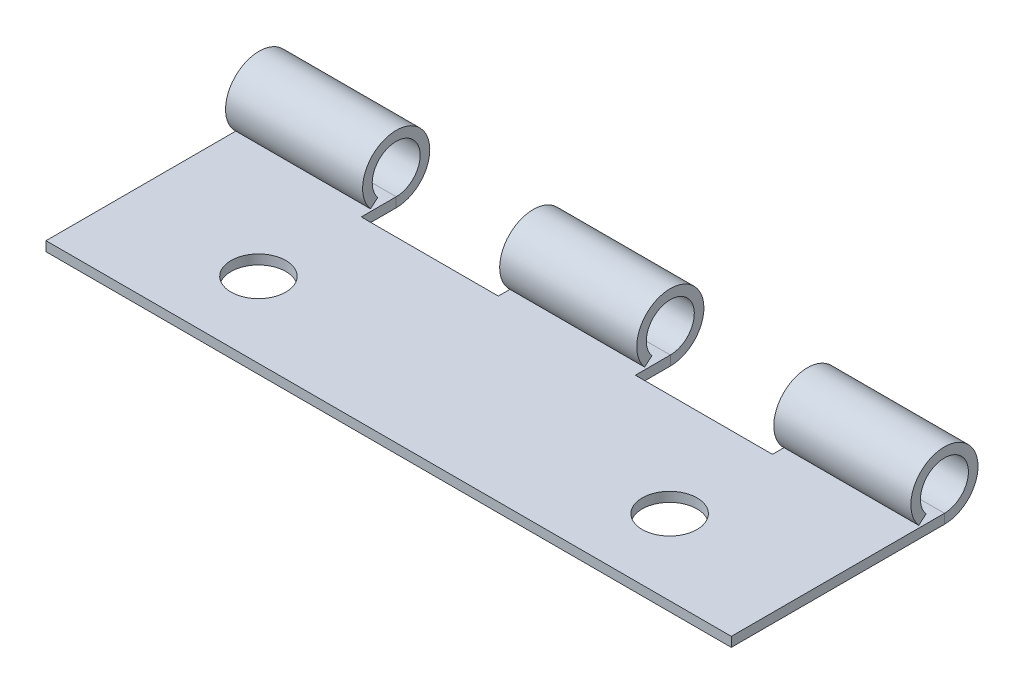
ISO-10303-21;
HEADER;
FILE_DESCRIPTION(('STEP AP214'),'2;1');
FILE_NAME('part.step','',(''),(''),'','','');
FILE_SCHEMA(('AUTOMOTIVE_DESIGN { 1 0 10303 214 1 1 1 1 }'));
ENDSEC;
DATA;
#1=APPLICATION_CONTEXT('core data for automotive mechanical design processes');
#2=APPLICATION_PROTOCOL_DEFINITION('international standard','automotive_design',2000,#1);
#3=PRODUCT_CONTEXT('',#1,'mechanical');
#4=PRODUCT('Part','Part','',(#3));
#5=PRODUCT_RELATED_PRODUCT_CATEGORY('part','',(#4));
#6=PRODUCT_DEFINITION_FORMATION('','',#4);
#7=PRODUCT_DEFINITION_CONTEXT('part definition',#1,'design');
#8=PRODUCT_DEFINITION('design','',#6,#7);
#9=PRODUCT_DEFINITION_SHAPE('','',#8);
#10=(LENGTH_UNIT() NAMED_UNIT(*) SI_UNIT(.MILLI.,.METRE.));
#11=(NAMED_UNIT(*) PLANE_ANGLE_UNIT() SI_UNIT($,.RADIAN.));
#12=(NAMED_UNIT(*) SI_UNIT($,.STERADIAN.) SOLID_ANGLE_UNIT());
#13=UNCERTAINTY_MEASURE_WITH_UNIT(LENGTH_MEASURE(1.E-05),#10,'distance_accuracy_value','');
#14=(GEOMETRIC_REPRESENTATION_CONTEXT(3) GLOBAL_UNCERTAINTY_ASSIGNED_CONTEXT((#13)) GLOBAL_UNIT_ASSIGNED_CONTEXT((#10,
#11,#12)) REPRESENTATION_CONTEXT('',''));
#15=CARTESIAN_POINT('',(0.,0.,0.));
#16=DIRECTION('',(0.,0.,1.));
#17=DIRECTION('',(1.,0.,0.));
#18=AXIS2_PLACEMENT_3D('',#15,#16,#17);
#19=CARTESIAN_POINT('',(15.,-0.7,-13.));
#20=DIRECTION('',(-1.,0.,0.));
#21=DIRECTION('',(0.,0.,1.));
#22=AXIS2_PLACEMENT_3D('',#19,#20,#21);
#23=PLANE('',#22);
#24=DIRECTION('',(0.,0.,1.));
#25=VECTOR('',#24,1.);
#26=CARTESIAN_POINT('',(15.,0.,-13.));
#27=LINE('',#26,#25);
#28=CARTESIAN_POINT('',(15.,0.,-15.55));
#29=VERTEX_POINT('',#28);
#30=CARTESIAN_POINT('',(15.,0.,-13.));
#31=VERTEX_POINT('',#30);
#32=EDGE_CURVE('E227',#29,#31,#27,.T.);
#33=ORIENTED_EDGE('',*,*,#32,.F.);
#34=DIRECTION('',(0.,-1.,0.));
#35=VECTOR('',#34,1.);
#36=CARTESIAN_POINT('',(15.,0.,-15.55));
#37=LINE('',#36,#35);
#38=CARTESIAN_POINT('',(15.,-0.699999999999999,-15.55));
#39=VERTEX_POINT('',#38);
#40=EDGE_CURVE('E177',#29,#39,#37,.T.);
#41=ORIENTED_EDGE('',*,*,#40,.T.);
#42=DIRECTION('',(0.,0.,1.));
#43=VECTOR('',#42,1.);
#44=CARTESIAN_POINT('',(15.,-0.7,-13.));
#45=LINE('',#44,#43);
#46=CARTESIAN_POINT('',(15.,-0.7,-13.));
#47=VERTEX_POINT('',#46);
#48=EDGE_CURVE('E198',#39,#47,#45,.T.);
#49=ORIENTED_EDGE('',*,*,#48,.T.);
#50=DIRECTION('',(0.,1.,0.));
#51=VECTOR('',#50,1.);
#52=CARTESIAN_POINT('',(15.,-0.7,-13.));
#53=LINE('',#52,#51);
#54=EDGE_CURVE('E252',#47,#31,#53,.T.);
#55=ORIENTED_EDGE('',*,*,#54,.T.);
#56=EDGE_LOOP('',(#33,#41,#49,#55));
#57=FACE_BOUND('',#56,.T.);
#58=ADVANCED_FACE('F36',(#57),#23,.T.);
#59=CARTESIAN_POINT('',(-5.,-0.7,-13.));
#60=DIRECTION('',(-1.,0.,0.));
#61=DIRECTION('',(0.,0.,1.));
#62=AXIS2_PLACEMENT_3D('',#59,#60,#61);
#63=PLANE('',#62);
#64=DIRECTION('',(0.,0.,1.));
#65=VECTOR('',#64,1.);
#66=CARTESIAN_POINT('',(-5.,0.,-13.));
#67=LINE('',#66,#65);
#68=CARTESIAN_POINT('',(-5.,0.,-15.55));
#69=VERTEX_POINT('',#68);
#70=CARTESIAN_POINT('',(-5.,0.,-13.));
#71=VERTEX_POINT('',#70);
#72=EDGE_CURVE('E236',#69,#71,#67,.T.);
#73=ORIENTED_EDGE('',*,*,#72,.F.);
#74=DIRECTION('',(0.,-1.,0.));
#75=VECTOR('',#74,1.);
#76=CARTESIAN_POINT('',(-5.,0.,-15.55));
#77=LINE('',#76,#75);
#78=CARTESIAN_POINT('',(-5.,-0.699999999999999,-15.55));
#79=VERTEX_POINT('',#78);
#80=EDGE_CURVE('E303',#69,#79,#77,.T.);
#81=ORIENTED_EDGE('',*,*,#80,.T.);
#82=DIRECTION('',(0.,0.,1.));
#83=VECTOR('',#82,1.);
#84=CARTESIAN_POINT('',(-5.,-0.7,-13.));
#85=LINE('',#84,#83);
#86=CARTESIAN_POINT('',(-5.,-0.7,-13.));
#87=VERTEX_POINT('',#86);
#88=EDGE_CURVE('E215',#79,#87,#85,.T.);
#89=ORIENTED_EDGE('',*,*,#88,.T.);
#90=DIRECTION('',(0.,1.,0.));
#91=VECTOR('',#90,1.);
#92=CARTESIAN_POINT('',(-5.,-0.7,-13.));
#93=LINE('',#92,#91);
#94=EDGE_CURVE('E248',#87,#71,#93,.T.);
#95=ORIENTED_EDGE('',*,*,#94,.T.);
#96=EDGE_LOOP('',(#73,#81,#89,#95));
#97=FACE_BOUND('',#96,.T.);
#98=ADVANCED_FACE('F302',(#97),#63,.T.);
#99=CARTESIAN_POINT('',(-25.,-0.7,0.));
#100=DIRECTION('',(-1.,0.,0.));
#101=DIRECTION('',(0.,0.,1.));
#102=AXIS2_PLACEMENT_3D('',#99,#100,#101);
#103=PLANE('',#102);
#104=DIRECTION('',(0.,0.,1.));
#105=VECTOR('',#104,1.);
#106=CARTESIAN_POINT('',(-25.,0.,0.));
#107=LINE('',#106,#105);
#108=CARTESIAN_POINT('',(-25.,0.,-15.55));
#109=VERTEX_POINT('',#108);
#110=CARTESIAN_POINT('',(-25.,0.,0.));
#111=VERTEX_POINT('',#110);
#112=EDGE_CURVE('E244',#109,#111,#107,.T.);
#113=ORIENTED_EDGE('',*,*,#112,.F.);
#114=DIRECTION('',(0.,-1.,0.));
#115=VECTOR('',#114,1.);
#116=CARTESIAN_POINT('',(-25.,0.,-15.55));
#117=LINE('',#116,#115);
#118=CARTESIAN_POINT('',(-25.,-0.699999999999999,-15.55));
#119=VERTEX_POINT('',#118);
#120=EDGE_CURVE('E274',#109,#119,#117,.T.);
#121=ORIENTED_EDGE('',*,*,#120,.T.);
#122=DIRECTION('',(0.,0.,1.));
#123=VECTOR('',#122,1.);
#124=CARTESIAN_POINT('',(-25.,-0.7,0.));
#125=LINE('',#124,#123);
#126=CARTESIAN_POINT('',(-25.,-0.7,0.));
#127=VERTEX_POINT('',#126);
#128=EDGE_CURVE('E223',#119,#127,#125,.T.);
#129=ORIENTED_EDGE('',*,*,#128,.T.);
#130=DIRECTION('',(0.,1.,0.));
#131=VECTOR('',#130,1.);
#132=CARTESIAN_POINT('',(-25.,-0.7,0.));
#133=LINE('',#132,#131);
#134=EDGE_CURVE('E11',#127,#111,#133,.T.);
#135=ORIENTED_EDGE('',*,*,#134,.T.);
#136=EDGE_LOOP('',(#113,#121,#129,#135));
#137=FACE_BOUND('',#136,.T.);
#138=ADVANCED_FACE('F271',(#137),#103,.T.);
#139=CARTESIAN_POINT('',(0.,-0.7,0.));
#140=DIRECTION('',(0.,0.,1.));
#141=DIRECTION('',(1.,0.,0.));
#142=AXIS2_PLACEMENT_3D('',#139,#140,#141);
#143=PLANE('',#142);
#144=DIRECTION('',(1.,0.,0.));
#145=VECTOR('',#144,1.);
#146=CARTESIAN_POINT('',(0.,0.,0.));
#147=LINE('',#146,#145);
#148=CARTESIAN_POINT('',(25.,0.,0.));
#149=VERTEX_POINT('',#148);
#150=EDGE_CURVE('E206',#111,#149,#147,.T.);
#151=ORIENTED_EDGE('',*,*,#150,.F.);
#152=ORIENTED_EDGE('',*,*,#134,.F.);
#153=DIRECTION('',(1.,0.,0.));
#154=VECTOR('',#153,1.);
#155=CARTESIAN_POINT('',(25.,-0.7,0.));
#156=LINE('',#155,#154);
#157=CARTESIAN_POINT('',(25.,-0.7,0.));
#158=VERTEX_POINT('',#157);
#159=EDGE_CURVE('E202',#127,#158,#156,.T.);
#160=ORIENTED_EDGE('',*,*,#159,.T.);
#161=DIRECTION('',(0.,1.,0.));
#162=VECTOR('',#161,1.);
#163=CARTESIAN_POINT('',(25.,-0.7,0.));
#164=LINE('',#163,#162);
#165=EDGE_CURVE('E40',#158,#149,#164,.T.);
#166=ORIENTED_EDGE('',*,*,#165,.T.);
#167=EDGE_LOOP('',(#151,#152,#160,#166));
#168=FACE_BOUND('',#167,.T.);
#169=ADVANCED_FACE('F260',(#168),#143,.T.);
#170=CARTESIAN_POINT('',(-15.,-0.7,-18.));
#171=DIRECTION('',(1.,0.,0.));
#172=DIRECTION('',(0.,0.,-1.));
#173=AXIS2_PLACEMENT_3D('',#170,#171,#172);
#174=PLANE('',#173);
#175=DIRECTION('',(0.,-1.,0.));
#176=VECTOR('',#175,1.);
#177=CARTESIAN_POINT('',(-15.,0.,-15.55));
#178=LINE('',#177,#176);
#179=CARTESIAN_POINT('',(-15.,0.,-15.55));
#180=VERTEX_POINT('',#179);
#181=CARTESIAN_POINT('',(-15.,-0.699999999999999,-15.55));
#182=VERTEX_POINT('',#181);
#183=EDGE_CURVE('E290',#180,#182,#178,.T.);
#184=ORIENTED_EDGE('',*,*,#183,.F.);
#185=DIRECTION('',(0.,0.,-1.));
#186=VECTOR('',#185,1.);
#187=CARTESIAN_POINT('',(-15.,0.,-18.));
#188=LINE('',#187,#186);
#189=CARTESIAN_POINT('',(-15.,0.,-13.));
#190=VERTEX_POINT('',#189);
#191=EDGE_CURVE('E241',#190,#180,#188,.T.);
#192=ORIENTED_EDGE('',*,*,#191,.F.);
#193=DIRECTION('',(0.,1.,0.));
#194=VECTOR('',#193,1.);
#195=CARTESIAN_POINT('',(-15.,-0.7,-13.));
#196=LINE('',#195,#194);
#197=CARTESIAN_POINT('',(-15.,-0.7,-13.));
#198=VERTEX_POINT('',#197);
#199=EDGE_CURVE('E45',#198,#190,#196,.T.);
#200=ORIENTED_EDGE('',*,*,#199,.F.);
#201=DIRECTION('',(0.,0.,-1.));
#202=VECTOR('',#201,1.);
#203=CARTESIAN_POINT('',(-15.,-0.7,-18.));
#204=LINE('',#203,#202);
#205=EDGE_CURVE('E220',#198,#182,#204,.T.);
#206=ORIENTED_EDGE('',*,*,#205,.T.);
#207=EDGE_LOOP('',(#184,#192,#200,#206));
#208=FACE_BOUND('',#207,.T.);
#209=ADVANCED_FACE('F288',(#208),#174,.T.);
#210=CARTESIAN_POINT('',(-15.,-0.7,-13.));
#211=DIRECTION('',(0.,0.,-1.));
#212=DIRECTION('',(-1.,0.,0.));
#213=AXIS2_PLACEMENT_3D('',#210,#211,#212);
#214=PLANE('',#213);
#215=DIRECTION('',(-1.,0.,0.));
#216=VECTOR('',#215,1.);
#217=CARTESIAN_POINT('',(-15.,0.,-13.));
#218=LINE('',#217,#216);
#219=EDGE_CURVE('E238',#71,#190,#218,.T.);
#220=ORIENTED_EDGE('',*,*,#219,.F.);
#221=ORIENTED_EDGE('',*,*,#94,.F.);
#222=DIRECTION('',(-1.,0.,0.));
#223=VECTOR('',#222,1.);
#224=CARTESIAN_POINT('',(-15.,-0.7,-13.));
#225=LINE('',#224,#223);
#226=EDGE_CURVE('E217',#87,#198,#225,.T.);
#227=ORIENTED_EDGE('',*,*,#226,.T.);
#228=ORIENTED_EDGE('',*,*,#199,.T.);
#229=EDGE_LOOP('',(#220,#221,#227,#228));
#230=FACE_BOUND('',#229,.T.);
#231=ADVANCED_FACE('F293',(#230),#214,.T.);
#232=CARTESIAN_POINT('',(5.,-0.7,-18.));
#233=DIRECTION('',(1.,0.,0.));
#234=DIRECTION('',(0.,0.,-1.));
#235=AXIS2_PLACEMENT_3D('',#232,#233,#234);
#236=PLANE('',#235);
#237=DIRECTION('',(0.,-1.,0.));
#238=VECTOR('',#237,1.);
#239=CARTESIAN_POINT('',(5.,0.,-15.55));
#240=LINE('',#239,#238);
#241=CARTESIAN_POINT('',(5.,0.,-15.55));
#242=VERTEX_POINT('',#241);
#243=CARTESIAN_POINT('',(5.,-0.699999999999999,-15.55));
#244=VERTEX_POINT('',#243);
#245=EDGE_CURVE('E307',#242,#244,#240,.T.);
#246=ORIENTED_EDGE('',*,*,#245,.F.);
#247=DIRECTION('',(0.,0.,-1.));
#248=VECTOR('',#247,1.);
#249=CARTESIAN_POINT('',(5.,0.,-18.));
#250=LINE('',#249,#248);
#251=CARTESIAN_POINT('',(5.,0.,-13.));
#252=VERTEX_POINT('',#251);
#253=EDGE_CURVE('E233',#252,#242,#250,.T.);
#254=ORIENTED_EDGE('',*,*,#253,.F.);
#255=DIRECTION('',(0.,1.,0.));
#256=VECTOR('',#255,1.);
#257=CARTESIAN_POINT('',(5.,-0.7,-13.));
#258=LINE('',#257,#256);
#259=CARTESIAN_POINT('',(5.,-0.7,-13.));
#260=VERTEX_POINT('',#259);
#261=EDGE_CURVE('E251',#260,#252,#258,.T.);
#262=ORIENTED_EDGE('',*,*,#261,.F.);
#263=DIRECTION('',(0.,0.,-1.));
#264=VECTOR('',#263,1.);
#265=CARTESIAN_POINT('',(5.,-0.7,-18.));
#266=LINE('',#265,#264);
#267=EDGE_CURVE('E212',#260,#244,#266,.T.);
#268=ORIENTED_EDGE('',*,*,#267,.T.);
#269=EDGE_LOOP('',(#246,#254,#262,#268));
#270=FACE_BOUND('',#269,.T.);
#271=ADVANCED_FACE('F374',(#270),#236,.T.);
#272=CARTESIAN_POINT('',(5.,-0.7,-13.));
#273=DIRECTION('',(0.,0.,-1.));
#274=DIRECTION('',(-1.,0.,0.));
#275=AXIS2_PLACEMENT_3D('',#272,#273,#274);
#276=PLANE('',#275);
#277=DIRECTION('',(-1.,0.,0.));
#278=VECTOR('',#277,1.);
#279=CARTESIAN_POINT('',(5.,0.,-13.));
#280=LINE('',#279,#278);
#281=EDGE_CURVE('E230',#31,#252,#280,.T.);
#282=ORIENTED_EDGE('',*,*,#281,.F.);
#283=ORIENTED_EDGE('',*,*,#54,.F.);
#284=DIRECTION('',(-1.,0.,0.));
#285=VECTOR('',#284,1.);
#286=CARTESIAN_POINT('',(5.,-0.7,-13.));
#287=LINE('',#286,#285);
#288=EDGE_CURVE('E204',#47,#260,#287,.T.);
#289=ORIENTED_EDGE('',*,*,#288,.T.);
#290=ORIENTED_EDGE('',*,*,#261,.T.);
#291=EDGE_LOOP('',(#282,#283,#289,#290));
#292=FACE_BOUND('',#291,.T.);
#293=ADVANCED_FACE('F371',(#292),#276,.T.);
#294=CARTESIAN_POINT('',(25.,-0.7,-18.));
#295=DIRECTION('',(1.,0.,0.));
#296=DIRECTION('',(0.,0.,-1.));
#297=AXIS2_PLACEMENT_3D('',#294,#295,#296);
#298=PLANE('',#297);
#299=DIRECTION('',(0.,-1.,0.));
#300=VECTOR('',#299,1.);
#301=CARTESIAN_POINT('',(25.,0.,-15.55));
#302=LINE('',#301,#300);
#303=CARTESIAN_POINT('',(25.,0.,-15.55));
#304=VERTEX_POINT('',#303);
#305=CARTESIAN_POINT('',(25.,-0.699999999999998,-15.55));
#306=VERTEX_POINT('',#305);
#307=EDGE_CURVE('E166',#304,#306,#302,.T.);
#308=ORIENTED_EDGE('',*,*,#307,.F.);
#309=DIRECTION('',(0.,0.,-1.));
#310=VECTOR('',#309,1.);
#311=CARTESIAN_POINT('',(25.,0.,-18.));
#312=LINE('',#311,#310);
#313=EDGE_CURVE('E225',#149,#304,#312,.T.);
#314=ORIENTED_EDGE('',*,*,#313,.F.);
#315=ORIENTED_EDGE('',*,*,#165,.F.);
#316=DIRECTION('',(0.,0.,-1.));
#317=VECTOR('',#316,1.);
#318=CARTESIAN_POINT('',(25.,-0.7,-18.));
#319=LINE('',#318,#317);
#320=EDGE_CURVE('E195',#158,#306,#319,.T.);
#321=ORIENTED_EDGE('',*,*,#320,.T.);
#322=EDGE_LOOP('',(#308,#314,#315,#321));
#323=FACE_BOUND('',#322,.T.);
#324=ADVANCED_FACE('F38',(#323),#298,.T.);
#325=CARTESIAN_POINT('',(0.,-0.7,0.));
#326=DIRECTION('',(0.,-1.,0.));
#327=DIRECTION('',(0.,0.,-1.));
#328=AXIS2_PLACEMENT_3D('',#325,#326,#327);
#329=PLANE('',#328);
#330=DIRECTION('',(-1.,0.,0.));
#331=VECTOR('',#330,1.);
#332=CARTESIAN_POINT('',(15.,-0.699999999999999,-15.55));
#333=LINE('',#332,#331);
#334=EDGE_CURVE('E184',#39,#306,#333,.F.);
#335=ORIENTED_EDGE('',*,*,#334,.T.);
#336=ORIENTED_EDGE('',*,*,#320,.F.);
#337=ORIENTED_EDGE('',*,*,#159,.F.);
#338=ORIENTED_EDGE('',*,*,#128,.F.);
#339=DIRECTION('',(-1.,0.,0.));
#340=VECTOR('',#339,1.);
#341=CARTESIAN_POINT('',(-25.,-0.699999999999999,-15.55));
#342=LINE('',#341,#340);
#343=EDGE_CURVE('E277',#119,#182,#342,.F.);
#344=ORIENTED_EDGE('',*,*,#343,.T.);
#345=ORIENTED_EDGE('',*,*,#205,.F.);
#346=ORIENTED_EDGE('',*,*,#226,.F.);
#347=ORIENTED_EDGE('',*,*,#88,.F.);
#348=DIRECTION('',(-1.,0.,0.));
#349=VECTOR('',#348,1.);
#350=CARTESIAN_POINT('',(-5.,-0.699999999999999,-15.55));
#351=LINE('',#350,#349);
#352=EDGE_CURVE('E298',#79,#244,#351,.F.);
#353=ORIENTED_EDGE('',*,*,#352,.T.);
#354=ORIENTED_EDGE('',*,*,#267,.F.);
#355=ORIENTED_EDGE('',*,*,#288,.F.);
#356=ORIENTED_EDGE('',*,*,#48,.F.);
#357=EDGE_LOOP('',(#335,#336,#337,#338,#344,#345,#346,#347,#353,#354,#355,#356));
#358=FACE_BOUND('',#357,.T.);
#359=CARTESIAN_POINT('',(15.,-0.7,-5.5));
#360=DIRECTION('',(0.,1.,0.));
#361=DIRECTION('',(0.,0.,-1.));
#362=AXIS2_PLACEMENT_3D('',#359,#360,#361);
#363=CIRCLE('',#362,2.);
#364=CARTESIAN_POINT('',(15.,-0.7,-7.5));
#365=VERTEX_POINT('',#364);
#366=EDGE_CURVE('E340',#365,#365,#363,.T.);
#367=ORIENTED_EDGE('',*,*,#366,.T.);
#368=EDGE_LOOP('',(#367));
#369=FACE_BOUND('',#368,.T.);
#370=CARTESIAN_POINT('',(-15.,-0.7,-5.49999999999999));
#371=DIRECTION('',(0.,1.,0.));
#372=DIRECTION('',(0.,0.,1.));
#373=AXIS2_PLACEMENT_3D('',#370,#371,#372);
#374=CIRCLE('',#373,2.);
#375=CARTESIAN_POINT('',(-15.,-0.7,-3.49999999999999));
#376=VERTEX_POINT('',#375);
#377=EDGE_CURVE('E228',#376,#376,#374,.T.);
#378=ORIENTED_EDGE('',*,*,#377,.T.);
#379=EDGE_LOOP('',(#378));
#380=FACE_BOUND('',#379,.T.);
#381=ADVANCED_FACE('F192',(#358,#369,#380),#329,.T.);
#382=CARTESIAN_POINT('',(0.,0.,0.));
#383=DIRECTION('',(0.,-1.,0.));
#384=DIRECTION('',(0.,0.,-1.));
#385=AXIS2_PLACEMENT_3D('',#382,#383,#384);
#386=PLANE('',#385);
#387=CARTESIAN_POINT('',(15.,0.,-5.5));
#388=DIRECTION('',(0.,1.,0.));
#389=DIRECTION('',(0.,0.,-1.));
#390=AXIS2_PLACEMENT_3D('',#387,#388,#389);
#391=CIRCLE('',#390,2.);
#392=CARTESIAN_POINT('',(15.,0.,-7.5));
#393=VERTEX_POINT('',#392);
#394=EDGE_CURVE('E338',#393,#393,#391,.T.);
#395=ORIENTED_EDGE('',*,*,#394,.F.);
#396=EDGE_LOOP('',(#395));
#397=FACE_BOUND('',#396,.T.);
#398=CARTESIAN_POINT('',(-15.,0.,-5.49999999999999));
#399=DIRECTION('',(0.,1.,0.));
#400=DIRECTION('',(0.,0.,1.));
#401=AXIS2_PLACEMENT_3D('',#398,#399,#400);
#402=CIRCLE('',#401,2.);
#403=CARTESIAN_POINT('',(-15.,0.,-3.49999999999999));
#404=VERTEX_POINT('',#403);
#405=EDGE_CURVE('E343',#404,#404,#402,.T.);
#406=ORIENTED_EDGE('',*,*,#405,.F.);
#407=EDGE_LOOP('',(#406));
#408=FACE_BOUND('',#407,.T.);
#409=ORIENTED_EDGE('',*,*,#313,.T.);
#410=DIRECTION('',(-1.,0.,0.));
#411=VECTOR('',#410,1.);
#412=CARTESIAN_POINT('',(15.,0.,-15.55));
#413=LINE('',#412,#411);
#414=EDGE_CURVE('E265',#29,#304,#413,.F.);
#415=ORIENTED_EDGE('',*,*,#414,.F.);
#416=ORIENTED_EDGE('',*,*,#32,.T.);
#417=ORIENTED_EDGE('',*,*,#281,.T.);
#418=ORIENTED_EDGE('',*,*,#253,.T.);
#419=DIRECTION('',(-1.,0.,0.));
#420=VECTOR('',#419,1.);
#421=CARTESIAN_POINT('',(-5.,0.,-15.55));
#422=LINE('',#421,#420);
#423=EDGE_CURVE('E690',#69,#242,#422,.F.);
#424=ORIENTED_EDGE('',*,*,#423,.F.);
#425=ORIENTED_EDGE('',*,*,#72,.T.);
#426=ORIENTED_EDGE('',*,*,#219,.T.);
#427=ORIENTED_EDGE('',*,*,#191,.T.);
#428=DIRECTION('',(-1.,0.,0.));
#429=VECTOR('',#428,1.);
#430=CARTESIAN_POINT('',(-25.,0.,-15.55));
#431=LINE('',#430,#429);
#432=EDGE_CURVE('E268',#109,#180,#431,.F.);
#433=ORIENTED_EDGE('',*,*,#432,.F.);
#434=ORIENTED_EDGE('',*,*,#112,.T.);
#435=ORIENTED_EDGE('',*,*,#150,.T.);
#436=EDGE_LOOP('',(#409,#415,#416,#417,#418,#424,#425,#426,#427,#433,#434,#435));
#437=FACE_BOUND('',#436,.T.);
#438=ADVANCED_FACE('F264',(#397,#408,#437),#386,.F.);
#439=CARTESIAN_POINT('',(-15.,-0.7,-5.49999999999999));
#440=DIRECTION('',(0.,1.,0.));
#441=DIRECTION('',(0.,0.,1.));
#442=AXIS2_PLACEMENT_3D('',#439,#440,#441);
#443=CYLINDRICAL_SURFACE('',#442,2.);
#444=ORIENTED_EDGE('',*,*,#377,.F.);
#445=EDGE_LOOP('',(#444));
#446=FACE_BOUND('',#445,.T.);
#447=ORIENTED_EDGE('',*,*,#405,.T.);
#448=EDGE_LOOP('',(#447));
#449=FACE_BOUND('',#448,.T.);
#450=ADVANCED_FACE('F350',(#446,#449),#443,.F.);
#451=CARTESIAN_POINT('',(15.,-0.7,-5.5));
#452=DIRECTION('',(0.,1.,0.));
#453=DIRECTION('',(0.,0.,1.));
#454=AXIS2_PLACEMENT_3D('',#451,#452,#453);
#455=CYLINDRICAL_SURFACE('',#454,2.);
#456=ORIENTED_EDGE('',*,*,#366,.F.);
#457=EDGE_LOOP('',(#456));
#458=FACE_BOUND('',#457,.T.);
#459=ORIENTED_EDGE('',*,*,#394,.T.);
#460=EDGE_LOOP('',(#459));
#461=FACE_BOUND('',#460,.T.);
#462=ADVANCED_FACE('F359',(#458,#461),#455,.F.);
#463=CARTESIAN_POINT('',(-20.,0.625121683048546,-14.2094222245418));
#464=DIRECTION('',(0.,0.766044443118973,0.642787609686546));
#465=DIRECTION('',(-1.,0.,0.));
#466=AXIS2_PLACEMENT_3D('',#463,#464,#465);
#467=PLANE('',#466);
#468=DIRECTION('',(0.,-0.642787609686545,0.766044443118973));
#469=VECTOR('',#468,1.);
#470=CARTESIAN_POINT('',(-25.,0.625121683048546,-14.2094222245418));
#471=LINE('',#470,#469);
#472=CARTESIAN_POINT('',(-25.,0.625121683048546,-14.2094222245418));
#473=VERTEX_POINT('',#472);
#474=CARTESIAN_POINT('',(-25.,0.175170356267964,-13.6731911143585));
#475=VERTEX_POINT('',#474);
#476=EDGE_CURVE('E336',#473,#475,#471,.T.);
#477=ORIENTED_EDGE('',*,*,#476,.F.);
#478=DIRECTION('',(-1.,0.,0.));
#479=VECTOR('',#478,1.);
#480=CARTESIAN_POINT('',(-25.,0.625121683048546,-14.2094222245418));
#481=LINE('',#480,#479);
#482=CARTESIAN_POINT('',(-15.,0.625121683048545,-14.2094222245418));
#483=VERTEX_POINT('',#482);
#484=EDGE_CURVE('E330',#483,#473,#481,.T.);
#485=ORIENTED_EDGE('',*,*,#484,.F.);
#486=DIRECTION('',(0.,-0.642787609686545,0.766044443118973));
#487=VECTOR('',#486,1.);
#488=CARTESIAN_POINT('',(-15.,0.625121683048545,-14.2094222245418));
#489=LINE('',#488,#487);
#490=CARTESIAN_POINT('',(-15.,0.175170356267964,-13.6731911143585));
#491=VERTEX_POINT('',#490);
#492=EDGE_CURVE('E334',#483,#491,#489,.T.);
#493=ORIENTED_EDGE('',*,*,#492,.T.);
#494=DIRECTION('',(-1.,0.,0.));
#495=VECTOR('',#494,1.);
#496=CARTESIAN_POINT('',(-25.,0.175170356267964,-13.6731911143585));
#497=LINE('',#496,#495);
#498=EDGE_CURVE('E320',#491,#475,#497,.T.);
#499=ORIENTED_EDGE('',*,*,#498,.T.);
#500=EDGE_LOOP('',(#477,#485,#493,#499));
#501=FACE_BOUND('',#500,.T.);
#502=ADVANCED_FACE('F427',(#501),#467,.F.);
#503=CARTESIAN_POINT('',(-15.,1.75,-15.55));
#504=DIRECTION('',(1.,0.,0.));
#505=DIRECTION('',(0.,1.,0.));
#506=AXIS2_PLACEMENT_3D('',#503,#504,#505);
#507=PLANE('',#506);
#508=ORIENTED_EDGE('',*,*,#492,.F.);
#509=CARTESIAN_POINT('',(-15.,1.75,-15.55));
#510=DIRECTION('',(-1.,0.,0.));
#511=DIRECTION('',(0.,-1.,0.));
#512=AXIS2_PLACEMENT_3D('',#509,#510,#511);
#513=CIRCLE('',#512,1.75);
#514=EDGE_CURVE('E323',#180,#483,#513,.F.);
#515=ORIENTED_EDGE('',*,*,#514,.F.);
#516=ORIENTED_EDGE('',*,*,#183,.T.);
#517=CARTESIAN_POINT('',(-15.,1.75,-15.55));
#518=DIRECTION('',(-1.,0.,0.));
#519=DIRECTION('',(0.,-1.,0.));
#520=AXIS2_PLACEMENT_3D('',#517,#518,#519);
#521=CIRCLE('',#520,2.45);
#522=EDGE_CURVE('E283',#182,#491,#521,.F.);
#523=ORIENTED_EDGE('',*,*,#522,.T.);
#524=EDGE_LOOP('',(#508,#515,#516,#523));
#525=FACE_BOUND('',#524,.T.);
#526=ADVANCED_FACE('F432',(#525),#507,.T.);
#527=CARTESIAN_POINT('',(-25.,1.75,-15.55));
#528=DIRECTION('',(1.,0.,0.));
#529=DIRECTION('',(0.,1.,0.));
#530=AXIS2_PLACEMENT_3D('',#527,#528,#529);
#531=PLANE('',#530);
#532=CARTESIAN_POINT('',(-25.,1.75,-15.55));
#533=DIRECTION('',(-1.,0.,0.));
#534=DIRECTION('',(0.,-1.,0.));
#535=AXIS2_PLACEMENT_3D('',#532,#533,#534);
#536=CIRCLE('',#535,1.75);
#537=EDGE_CURVE('E328',#473,#109,#536,.T.);
#538=ORIENTED_EDGE('',*,*,#537,.F.);
#539=ORIENTED_EDGE('',*,*,#476,.T.);
#540=CARTESIAN_POINT('',(-25.,1.75,-15.55));
#541=DIRECTION('',(-1.,0.,0.));
#542=DIRECTION('',(0.,-1.,0.));
#543=AXIS2_PLACEMENT_3D('',#540,#541,#542);
#544=CIRCLE('',#543,2.45);
#545=EDGE_CURVE('E284',#475,#119,#544,.T.);
#546=ORIENTED_EDGE('',*,*,#545,.T.);
#547=ORIENTED_EDGE('',*,*,#120,.F.);
#548=EDGE_LOOP('',(#538,#539,#546,#547));
#549=FACE_BOUND('',#548,.T.);
#550=ADVANCED_FACE('F445',(#549),#531,.F.);
#551=CARTESIAN_POINT('',(-25.,1.75,-15.55));
#552=DIRECTION('',(-1.,0.,0.));
#553=DIRECTION('',(0.,-0.642787609686546,0.766044443118973));
#554=AXIS2_PLACEMENT_3D('',#551,#552,#553);
#555=CYLINDRICAL_SURFACE('',#554,2.45);
#556=ORIENTED_EDGE('',*,*,#343,.F.);
#557=ORIENTED_EDGE('',*,*,#545,.F.);
#558=ORIENTED_EDGE('',*,*,#498,.F.);
#559=ORIENTED_EDGE('',*,*,#522,.F.);
#560=EDGE_LOOP('',(#556,#557,#558,#559));
#561=FACE_BOUND('',#560,.T.);
#562=ADVANCED_FACE('F456',(#561),#555,.T.);
#563=CARTESIAN_POINT('',(-25.,1.75,-15.55));
#564=DIRECTION('',(-1.,0.,0.));
#565=DIRECTION('',(0.,-0.642787609686546,0.766044443118973));
#566=AXIS2_PLACEMENT_3D('',#563,#564,#565);
#567=CYLINDRICAL_SURFACE('',#566,1.75);
#568=ORIENTED_EDGE('',*,*,#432,.T.);
#569=ORIENTED_EDGE('',*,*,#514,.T.);
#570=ORIENTED_EDGE('',*,*,#484,.T.);
#571=ORIENTED_EDGE('',*,*,#537,.T.);
#572=EDGE_LOOP('',(#568,#569,#570,#571));
#573=FACE_BOUND('',#572,.T.);
#574=ADVANCED_FACE('F467',(#573),#567,.F.);
#575=CARTESIAN_POINT('',(0.,0.625121683048546,-14.2094222245418));
#576=DIRECTION('',(0.,0.766044443118973,0.642787609686546));
#577=DIRECTION('',(-1.,0.,0.));
#578=AXIS2_PLACEMENT_3D('',#575,#576,#577);
#579=PLANE('',#578);
#580=DIRECTION('',(0.,-0.642787609686545,0.766044443118973));
#581=VECTOR('',#580,1.);
#582=CARTESIAN_POINT('',(-5.,0.625121683048546,-14.2094222245418));
#583=LINE('',#582,#581);
#584=CARTESIAN_POINT('',(-5.,0.625121683048546,-14.2094222245418));
#585=VERTEX_POINT('',#584);
#586=CARTESIAN_POINT('',(-5.,0.175170356267964,-13.6731911143585));
#587=VERTEX_POINT('',#586);
#588=EDGE_CURVE('E315',#585,#587,#583,.T.);
#589=ORIENTED_EDGE('',*,*,#588,.F.);
#590=DIRECTION('',(-1.,0.,0.));
#591=VECTOR('',#590,1.);
#592=CARTESIAN_POINT('',(-5.,0.625121683048546,-14.2094222245418));
#593=LINE('',#592,#591);
#594=CARTESIAN_POINT('',(5.,0.625121683048545,-14.2094222245418));
#595=VERTEX_POINT('',#594);
#596=EDGE_CURVE('E678',#595,#585,#593,.T.);
#597=ORIENTED_EDGE('',*,*,#596,.F.);
#598=DIRECTION('',(0.,-0.642787609686545,0.766044443118973));
#599=VECTOR('',#598,1.);
#600=CARTESIAN_POINT('',(5.,0.625121683048545,-14.2094222245418));
#601=LINE('',#600,#599);
#602=CARTESIAN_POINT('',(5.,0.175170356267964,-13.6731911143585));
#603=VERTEX_POINT('',#602);
#604=EDGE_CURVE('E310',#595,#603,#601,.T.);
#605=ORIENTED_EDGE('',*,*,#604,.T.);
#606=DIRECTION('',(-1.,0.,0.));
#607=VECTOR('',#606,1.);
#608=CARTESIAN_POINT('',(-5.,0.175170356267964,-13.6731911143585));
#609=LINE('',#608,#607);
#610=EDGE_CURVE('E683',#603,#587,#609,.T.);
#611=ORIENTED_EDGE('',*,*,#610,.T.);
#612=EDGE_LOOP('',(#589,#597,#605,#611));
#613=FACE_BOUND('',#612,.T.);
#614=ADVANCED_FACE('F477',(#613),#579,.F.);
#615=CARTESIAN_POINT('',(5.,1.75,-15.55));
#616=DIRECTION('',(1.,0.,0.));
#617=DIRECTION('',(0.,1.,0.));
#618=AXIS2_PLACEMENT_3D('',#615,#616,#617);
#619=PLANE('',#618);
#620=ORIENTED_EDGE('',*,*,#604,.F.);
#621=CARTESIAN_POINT('',(5.,1.75,-15.55));
#622=DIRECTION('',(-1.,0.,0.));
#623=DIRECTION('',(0.,-1.,0.));
#624=AXIS2_PLACEMENT_3D('',#621,#622,#623);
#625=CIRCLE('',#624,1.75);
#626=EDGE_CURVE('E686',#242,#595,#625,.F.);
#627=ORIENTED_EDGE('',*,*,#626,.F.);
#628=ORIENTED_EDGE('',*,*,#245,.T.);
#629=CARTESIAN_POINT('',(5.,1.75,-15.55));
#630=DIRECTION('',(-1.,0.,0.));
#631=DIRECTION('',(0.,-1.,0.));
#632=AXIS2_PLACEMENT_3D('',#629,#630,#631);
#633=CIRCLE('',#632,2.45);
#634=EDGE_CURVE('E308',#244,#603,#633,.F.);
#635=ORIENTED_EDGE('',*,*,#634,.T.);
#636=EDGE_LOOP('',(#620,#627,#628,#635));
#637=FACE_BOUND('',#636,.T.);
#638=ADVANCED_FACE('F488',(#637),#619,.T.);
#639=CARTESIAN_POINT('',(-5.,1.75,-15.55));
#640=DIRECTION('',(1.,0.,0.));
#641=DIRECTION('',(0.,1.,0.));
#642=AXIS2_PLACEMENT_3D('',#639,#640,#641);
#643=PLANE('',#642);
#644=CARTESIAN_POINT('',(-5.,1.75,-15.55));
#645=DIRECTION('',(-1.,0.,0.));
#646=DIRECTION('',(0.,-1.,0.));
#647=AXIS2_PLACEMENT_3D('',#644,#645,#646);
#648=CIRCLE('',#647,1.75);
#649=EDGE_CURVE('E61',#585,#69,#648,.T.);
#650=ORIENTED_EDGE('',*,*,#649,.F.);
#651=ORIENTED_EDGE('',*,*,#588,.T.);
#652=CARTESIAN_POINT('',(-5.,1.75,-15.55));
#653=DIRECTION('',(-1.,0.,0.));
#654=DIRECTION('',(0.,-1.,0.));
#655=AXIS2_PLACEMENT_3D('',#652,#653,#654);
#656=CIRCLE('',#655,2.45);
#657=EDGE_CURVE('E681',#587,#79,#656,.T.);
#658=ORIENTED_EDGE('',*,*,#657,.T.);
#659=ORIENTED_EDGE('',*,*,#80,.F.);
#660=EDGE_LOOP('',(#650,#651,#658,#659));
#661=FACE_BOUND('',#660,.T.);
#662=ADVANCED_FACE('F499',(#661),#643,.F.);
#663=CARTESIAN_POINT('',(-5.,1.75,-15.55));
#664=DIRECTION('',(-1.,0.,0.));
#665=DIRECTION('',(0.,-0.642787609686546,0.766044443118973));
#666=AXIS2_PLACEMENT_3D('',#663,#664,#665);
#667=CYLINDRICAL_SURFACE('',#666,2.45);
#668=ORIENTED_EDGE('',*,*,#352,.F.);
#669=ORIENTED_EDGE('',*,*,#657,.F.);
#670=ORIENTED_EDGE('',*,*,#610,.F.);
#671=ORIENTED_EDGE('',*,*,#634,.F.);
#672=EDGE_LOOP('',(#668,#669,#670,#671));
#673=FACE_BOUND('',#672,.T.);
#674=ADVANCED_FACE('F510',(#673),#667,.T.);
#675=CARTESIAN_POINT('',(-5.,1.75,-15.55));
#676=DIRECTION('',(-1.,0.,0.));
#677=DIRECTION('',(0.,-0.642787609686546,0.766044443118973));
#678=AXIS2_PLACEMENT_3D('',#675,#676,#677);
#679=CYLINDRICAL_SURFACE('',#678,1.75);
#680=ORIENTED_EDGE('',*,*,#423,.T.);
#681=ORIENTED_EDGE('',*,*,#626,.T.);
#682=ORIENTED_EDGE('',*,*,#596,.T.);
#683=ORIENTED_EDGE('',*,*,#649,.T.);
#684=EDGE_LOOP('',(#680,#681,#682,#683));
#685=FACE_BOUND('',#684,.T.);
#686=ADVANCED_FACE('F520',(#685),#679,.F.);
#687=CARTESIAN_POINT('',(20.,0.625121683048547,-14.2094222245418));
#688=DIRECTION('',(0.,0.766044443118973,0.642787609686545));
#689=DIRECTION('',(-1.,0.,0.));
#690=AXIS2_PLACEMENT_3D('',#687,#688,#689);
#691=PLANE('',#690);
#692=DIRECTION('',(0.,-0.642787609686545,0.766044443118973));
#693=VECTOR('',#692,1.);
#694=CARTESIAN_POINT('',(15.,0.625121683048547,-14.2094222245418));
#695=LINE('',#694,#693);
#696=CARTESIAN_POINT('',(15.,0.625121683048547,-14.2094222245418));
#697=VERTEX_POINT('',#696);
#698=CARTESIAN_POINT('',(15.,0.175170356267965,-13.6731911143585));
#699=VERTEX_POINT('',#698);
#700=EDGE_CURVE('E676',#697,#699,#695,.T.);
#701=ORIENTED_EDGE('',*,*,#700,.F.);
#702=DIRECTION('',(-1.,0.,0.));
#703=VECTOR('',#702,1.);
#704=CARTESIAN_POINT('',(15.,0.625121683048547,-14.2094222245418));
#705=LINE('',#704,#703);
#706=CARTESIAN_POINT('',(25.,0.625121683048548,-14.2094222245418));
#707=VERTEX_POINT('',#706);
#708=EDGE_CURVE('E670',#707,#697,#705,.T.);
#709=ORIENTED_EDGE('',*,*,#708,.F.);
#710=DIRECTION('',(0.,-0.642787609686545,0.766044443118973));
#711=VECTOR('',#710,1.);
#712=CARTESIAN_POINT('',(25.,0.625121683048548,-14.2094222245418));
#713=LINE('',#712,#711);
#714=CARTESIAN_POINT('',(25.,0.175170356267967,-13.6731911143585));
#715=VERTEX_POINT('',#714);
#716=EDGE_CURVE('E176',#707,#715,#713,.T.);
#717=ORIENTED_EDGE('',*,*,#716,.T.);
#718=DIRECTION('',(-1.,0.,0.));
#719=VECTOR('',#718,1.);
#720=CARTESIAN_POINT('',(15.,0.175170356267965,-13.6731911143585));
#721=LINE('',#720,#719);
#722=EDGE_CURVE('E187',#715,#699,#721,.T.);
#723=ORIENTED_EDGE('',*,*,#722,.T.);
#724=EDGE_LOOP('',(#701,#709,#717,#723));
#725=FACE_BOUND('',#724,.T.);
#726=ADVANCED_FACE('F531',(#725),#691,.F.);
#727=CARTESIAN_POINT('',(25.,1.75,-15.55));
#728=DIRECTION('',(1.,0.,0.));
#729=DIRECTION('',(0.,0.,-1.));
#730=AXIS2_PLACEMENT_3D('',#727,#728,#729);
#731=PLANE('',#730);
#732=ORIENTED_EDGE('',*,*,#716,.F.);
#733=CARTESIAN_POINT('',(25.,1.75,-15.55));
#734=DIRECTION('',(-1.,0.,0.));
#735=DIRECTION('',(0.,0.,1.));
#736=AXIS2_PLACEMENT_3D('',#733,#734,#735);
#737=CIRCLE('',#736,1.75);
#738=EDGE_CURVE('E171',#304,#707,#737,.F.);
#739=ORIENTED_EDGE('',*,*,#738,.F.);
#740=ORIENTED_EDGE('',*,*,#307,.T.);
#741=CARTESIAN_POINT('',(25.,1.75,-15.55));
#742=DIRECTION('',(-1.,0.,0.));
#743=DIRECTION('',(0.,0.,1.));
#744=AXIS2_PLACEMENT_3D('',#741,#742,#743);
#745=CIRCLE('',#744,2.45);
#746=EDGE_CURVE('E169',#306,#715,#745,.F.);
#747=ORIENTED_EDGE('',*,*,#746,.T.);
#748=EDGE_LOOP('',(#732,#739,#740,#747));
#749=FACE_BOUND('',#748,.T.);
#750=ADVANCED_FACE('F168',(#749),#731,.T.);
#751=CARTESIAN_POINT('',(15.,1.75,-15.55));
#752=DIRECTION('',(1.,0.,0.));
#753=DIRECTION('',(0.,0.,-1.));
#754=AXIS2_PLACEMENT_3D('',#751,#752,#753);
#755=PLANE('',#754);
#756=CARTESIAN_POINT('',(15.,1.75,-15.55));
#757=DIRECTION('',(-1.,0.,0.));
#758=DIRECTION('',(0.,0.,1.));
#759=AXIS2_PLACEMENT_3D('',#756,#757,#758);
#760=CIRCLE('',#759,1.75);
#761=EDGE_CURVE('E53',#697,#29,#760,.T.);
#762=ORIENTED_EDGE('',*,*,#761,.F.);
#763=ORIENTED_EDGE('',*,*,#700,.T.);
#764=CARTESIAN_POINT('',(15.,1.75,-15.55));
#765=DIRECTION('',(-1.,0.,0.));
#766=DIRECTION('',(0.,0.,1.));
#767=AXIS2_PLACEMENT_3D('',#764,#765,#766);
#768=CIRCLE('',#767,2.45);
#769=EDGE_CURVE('E199',#699,#39,#768,.T.);
#770=ORIENTED_EDGE('',*,*,#769,.T.);
#771=ORIENTED_EDGE('',*,*,#40,.F.);
#772=EDGE_LOOP('',(#762,#763,#770,#771));
#773=FACE_BOUND('',#772,.T.);
#774=ADVANCED_FACE('F551',(#773),#755,.F.);
#775=CARTESIAN_POINT('',(15.,1.75,-15.55));
#776=DIRECTION('',(-1.,0.,0.));
#777=DIRECTION('',(0.,-0.642787609686546,0.766044443118973));
#778=AXIS2_PLACEMENT_3D('',#775,#776,#777);
#779=CYLINDRICAL_SURFACE('',#778,2.45);
#780=ORIENTED_EDGE('',*,*,#334,.F.);
#781=ORIENTED_EDGE('',*,*,#769,.F.);
#782=ORIENTED_EDGE('',*,*,#722,.F.);
#783=ORIENTED_EDGE('',*,*,#746,.F.);
#784=EDGE_LOOP('',(#780,#781,#782,#783));
#785=FACE_BOUND('',#784,.T.);
#786=ADVANCED_FACE('F182',(#785),#779,.T.);
#787=CARTESIAN_POINT('',(15.,1.75,-15.55));
#788=DIRECTION('',(-1.,0.,0.));
#789=DIRECTION('',(0.,-0.642787609686546,0.766044443118973));
#790=AXIS2_PLACEMENT_3D('',#787,#788,#789);
#791=CYLINDRICAL_SURFACE('',#790,1.75);
#792=ORIENTED_EDGE('',*,*,#414,.T.);
#793=ORIENTED_EDGE('',*,*,#738,.T.);
#794=ORIENTED_EDGE('',*,*,#708,.T.);
#795=ORIENTED_EDGE('',*,*,#761,.T.);
#796=EDGE_LOOP('',(#792,#793,#794,#795));
#797=FACE_BOUND('',#796,.T.);
#798=ADVANCED_FACE('F571',(#797),#791,.F.);
#799=CLOSED_SHELL('',(#58,#98,#138,#169,#209,#231,#271,#293,#324,#381,#438,#450,#462,#502,#526,
#550,#562,#574,#614,#638,#662,#674,#686,#726,#750,#774,#786,#798));
#800=MANIFOLD_SOLID_BREP('B2',#799);
#801=ADVANCED_BREP_SHAPE_REPRESENTATION('',(#18,#800),#14);
#802=SHAPE_DEFINITION_REPRESENTATION(#9,#801);
ENDSEC;
END-ISO-10303-21;
